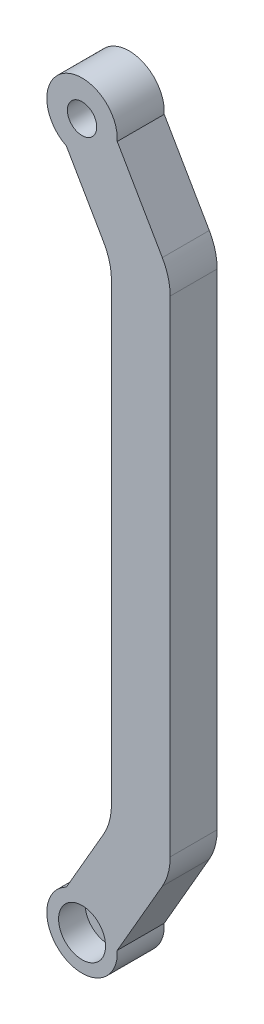
ISO-10303-21;
HEADER;
FILE_DESCRIPTION(('STEP AP214'),'2;1');
FILE_NAME('part.step','',(''),(''),'','','');
FILE_SCHEMA(('AUTOMOTIVE_DESIGN { 1 0 10303 214 1 1 1 1 }'));
ENDSEC;
DATA;
#1=APPLICATION_CONTEXT('core data for automotive mechanical design processes');
#2=APPLICATION_PROTOCOL_DEFINITION('international standard','automotive_design',2000,#1);
#3=PRODUCT_CONTEXT('',#1,'mechanical');
#4=PRODUCT('Part','Part','',(#3));
#5=PRODUCT_RELATED_PRODUCT_CATEGORY('part','',(#4));
#6=PRODUCT_DEFINITION_FORMATION('','',#4);
#7=PRODUCT_DEFINITION_CONTEXT('part definition',#1,'design');
#8=PRODUCT_DEFINITION('design','',#6,#7);
#9=PRODUCT_DEFINITION_SHAPE('','',#8);
#10=(LENGTH_UNIT() NAMED_UNIT(*) SI_UNIT(.MILLI.,.METRE.));
#11=(NAMED_UNIT(*) PLANE_ANGLE_UNIT() SI_UNIT($,.RADIAN.));
#12=(NAMED_UNIT(*) SI_UNIT($,.STERADIAN.) SOLID_ANGLE_UNIT());
#13=UNCERTAINTY_MEASURE_WITH_UNIT(LENGTH_MEASURE(1.E-05),#10,'distance_accuracy_value','');
#14=(GEOMETRIC_REPRESENTATION_CONTEXT(3) GLOBAL_UNCERTAINTY_ASSIGNED_CONTEXT((#13)) GLOBAL_UNIT_ASSIGNED_CONTEXT((#10,
#11,#12)) REPRESENTATION_CONTEXT('',''));
#15=CARTESIAN_POINT('',(0.,0.,0.));
#16=DIRECTION('',(0.,0.,1.));
#17=DIRECTION('',(1.,0.,0.));
#18=AXIS2_PLACEMENT_3D('',#15,#16,#17);
#19=CARTESIAN_POINT('',(0.,0.,0.));
#20=DIRECTION('',(0.,0.,1.));
#21=DIRECTION('',(1.,0.,0.));
#22=AXIS2_PLACEMENT_3D('',#19,#20,#21);
#23=CYLINDRICAL_SURFACE('',#22,2.);
#24=CARTESIAN_POINT('',(0.,0.,0.));
#25=DIRECTION('',(0.,0.,1.));
#26=DIRECTION('',(1.,0.,0.));
#27=AXIS2_PLACEMENT_3D('',#24,#25,#26);
#28=CIRCLE('',#27,2.);
#29=CARTESIAN_POINT('',(2.,0.,0.));
#30=VERTEX_POINT('',#29);
#31=EDGE_CURVE('E203',#30,#30,#28,.T.);
#32=ORIENTED_EDGE('',*,*,#31,.F.);
#33=EDGE_LOOP('',(#32));
#34=FACE_BOUND('',#33,.T.);
#35=CARTESIAN_POINT('',(0.,0.,3.5));
#36=DIRECTION('',(0.,0.,1.));
#37=DIRECTION('',(1.,0.,0.));
#38=AXIS2_PLACEMENT_3D('',#35,#36,#37);
#39=CIRCLE('',#38,2.);
#40=CARTESIAN_POINT('',(2.,0.,3.5));
#41=VERTEX_POINT('',#40);
#42=EDGE_CURVE('E200',#41,#41,#39,.F.);
#43=ORIENTED_EDGE('',*,*,#42,.F.);
#44=EDGE_LOOP('',(#43));
#45=FACE_BOUND('',#44,.T.);
#46=ADVANCED_FACE('F41',(#34,#45),#23,.F.);
#47=CARTESIAN_POINT('',(4.33012701892219,122.5,134.485785013841));
#48=DIRECTION('',(0.866025403784438,0.500000000000001,0.));
#49=DIRECTION('',(-0.500000000000001,0.866025403784438,0.));
#50=AXIS2_PLACEMENT_3D('',#47,#48,#49);
#51=PLANE('',#50);
#52=DIRECTION('',(0.500000000000001,-0.866025403784438,0.));
#53=VECTOR('',#52,1.);
#54=CARTESIAN_POINT('',(4.33012701892219,122.5,8.00000000000001));
#55=LINE('',#54,#53);
#56=CARTESIAN_POINT('',(5.9884394140999,119.627718676731,8.00000000000001));
#57=VERTEX_POINT('',#56);
#58=CARTESIAN_POINT('',(13.6602540378444,106.339745962156,8.00000000000001));
#59=VERTEX_POINT('',#58);
#60=EDGE_CURVE('E141',#57,#59,#55,.T.);
#61=ORIENTED_EDGE('',*,*,#60,.T.);
#62=DIRECTION('',(0.,0.,-1.));
#63=VECTOR('',#62,1.);
#64=CARTESIAN_POINT('',(13.6602540378444,106.339745962156,134.485785013841));
#65=LINE('',#64,#63);
#66=CARTESIAN_POINT('',(13.6602540378444,106.339745962156,0.));
#67=VERTEX_POINT('',#66);
#68=EDGE_CURVE('E214',#59,#67,#65,.T.);
#69=ORIENTED_EDGE('',*,*,#68,.T.);
#70=DIRECTION('',(0.500000000000001,-0.866025403784438,0.));
#71=VECTOR('',#70,1.);
#72=CARTESIAN_POINT('',(4.33012701892219,122.5,0.));
#73=LINE('',#72,#71);
#74=CARTESIAN_POINT('',(5.9884394140999,119.627718676731,0.));
#75=VERTEX_POINT('',#74);
#76=EDGE_CURVE('E168',#75,#67,#73,.T.);
#77=ORIENTED_EDGE('',*,*,#76,.F.);
#78=DIRECTION('',(0.,0.,-1.));
#79=VECTOR('',#78,1.);
#80=CARTESIAN_POINT('',(5.9884394140999,119.627718676731,8.));
#81=LINE('',#80,#79);
#82=EDGE_CURVE('E156',#75,#57,#81,.F.);
#83=ORIENTED_EDGE('',*,*,#82,.T.);
#84=EDGE_LOOP('',(#61,#69,#77,#83));
#85=FACE_BOUND('',#84,.T.);
#86=ADVANCED_FACE('F257',(#85),#51,.T.);
#87=CARTESIAN_POINT('',(-4.33012701892219,117.5,134.485785013841));
#88=DIRECTION('',(0.866025403784438,0.500000000000001,0.));
#89=DIRECTION('',(-0.500000000000001,0.866025403784438,0.));
#90=AXIS2_PLACEMENT_3D('',#87,#88,#89);
#91=PLANE('',#90);
#92=DIRECTION('',(0.500000000000001,-0.866025403784438,0.));
#93=VECTOR('',#92,1.);
#94=CARTESIAN_POINT('',(-4.33012701892219,117.5,0.));
#95=LINE('',#94,#93);
#96=CARTESIAN_POINT('',(-2.67181462374449,114.627718676731,0.));
#97=VERTEX_POINT('',#96);
#98=CARTESIAN_POINT('',(3.6602540378444,103.660254037844,0.));
#99=VERTEX_POINT('',#98);
#100=EDGE_CURVE('E131',#97,#99,#95,.T.);
#101=ORIENTED_EDGE('',*,*,#100,.T.);
#102=DIRECTION('',(0.,0.,-1.));
#103=VECTOR('',#102,1.);
#104=CARTESIAN_POINT('',(3.6602540378444,103.660254037844,8.00000000000001));
#105=LINE('',#104,#103);
#106=CARTESIAN_POINT('',(3.6602540378444,103.660254037844,8.00000000000001));
#107=VERTEX_POINT('',#106);
#108=EDGE_CURVE('E212',#99,#107,#105,.F.);
#109=ORIENTED_EDGE('',*,*,#108,.T.);
#110=DIRECTION('',(0.500000000000001,-0.866025403784438,0.));
#111=VECTOR('',#110,1.);
#112=CARTESIAN_POINT('',(-4.33012701892219,117.5,8.00000000000001));
#113=LINE('',#112,#111);
#114=CARTESIAN_POINT('',(-2.67181462374449,114.627718676731,8.00000000000001));
#115=VERTEX_POINT('',#114);
#116=EDGE_CURVE('E147',#115,#107,#113,.T.);
#117=ORIENTED_EDGE('',*,*,#116,.F.);
#118=DIRECTION('',(0.,0.,-1.));
#119=VECTOR('',#118,1.);
#120=CARTESIAN_POINT('',(-2.67181462374448,114.627718676731,8.));
#121=LINE('',#120,#119);
#122=EDGE_CURVE('E144',#97,#115,#121,.F.);
#123=ORIENTED_EDGE('',*,*,#122,.F.);
#124=EDGE_LOOP('',(#101,#109,#117,#123));
#125=FACE_BOUND('',#124,.T.);
#126=ADVANCED_FACE('F145',(#125),#91,.F.);
#127=CARTESIAN_POINT('',(0.,0.,8.));
#128=DIRECTION('',(0.,0.,-1.));
#129=DIRECTION('',(-1.,0.,0.));
#130=AXIS2_PLACEMENT_3D('',#127,#128,#129);
#131=CYLINDRICAL_SURFACE('',#130,6.);
#132=DIRECTION('',(0.,0.,-1.));
#133=VECTOR('',#132,1.);
#134=CARTESIAN_POINT('',(-2.67181462374448,5.37228132326902,8.));
#135=LINE('',#134,#133);
#136=CARTESIAN_POINT('',(-2.67181462374449,5.37228132326902,0.));
#137=VERTEX_POINT('',#136);
#138=CARTESIAN_POINT('',(-2.67181462374449,5.37228132326902,8.));
#139=VERTEX_POINT('',#138);
#140=EDGE_CURVE('E192',#137,#139,#135,.F.);
#141=ORIENTED_EDGE('',*,*,#140,.F.);
#142=CARTESIAN_POINT('',(0.,0.,0.));
#143=DIRECTION('',(0.,0.,1.));
#144=DIRECTION('',(1.,0.,0.));
#145=AXIS2_PLACEMENT_3D('',#142,#143,#144);
#146=CIRCLE('',#145,6.);
#147=CARTESIAN_POINT('',(5.98843941409989,0.372281323269007,0.));
#148=VERTEX_POINT('',#147);
#149=EDGE_CURVE('E195',#137,#148,#146,.T.);
#150=ORIENTED_EDGE('',*,*,#149,.T.);
#151=DIRECTION('',(0.,0.,-1.));
#152=VECTOR('',#151,1.);
#153=CARTESIAN_POINT('',(5.9884394140999,0.37228132326901,8.));
#154=LINE('',#153,#152);
#155=CARTESIAN_POINT('',(5.98843941409989,0.372281323269002,8.00000000000001));
#156=VERTEX_POINT('',#155);
#157=EDGE_CURVE('E180',#148,#156,#154,.F.);
#158=ORIENTED_EDGE('',*,*,#157,.T.);
#159=CARTESIAN_POINT('',(0.,0.,8.));
#160=DIRECTION('',(0.,0.,1.));
#161=DIRECTION('',(1.,0.,0.));
#162=AXIS2_PLACEMENT_3D('',#159,#160,#161);
#163=CIRCLE('',#162,6.);
#164=EDGE_CURVE('E152',#139,#156,#163,.T.);
#165=ORIENTED_EDGE('',*,*,#164,.F.);
#166=EDGE_LOOP('',(#141,#150,#158,#165));
#167=FACE_BOUND('',#166,.T.);
#168=ADVANCED_FACE('F269',(#167),#131,.T.);
#169=CARTESIAN_POINT('',(0.,0.,8.));
#170=DIRECTION('',(0.,0.,1.));
#171=DIRECTION('',(1.,0.,0.));
#172=AXIS2_PLACEMENT_3D('',#169,#170,#171);
#173=PLANE('',#172);
#174=CARTESIAN_POINT('',(0.,0.,8.));
#175=DIRECTION('',(0.,0.,1.));
#176=DIRECTION('',(1.,0.,0.));
#177=AXIS2_PLACEMENT_3D('',#174,#175,#176);
#178=CIRCLE('',#177,4.);
#179=CARTESIAN_POINT('',(4.,0.,8.));
#180=VERTEX_POINT('',#179);
#181=EDGE_CURVE('E320',#180,#180,#178,.T.);
#182=ORIENTED_EDGE('',*,*,#181,.F.);
#183=EDGE_LOOP('',(#182));
#184=FACE_BOUND('',#183,.T.);
#185=CARTESIAN_POINT('',(0.,120.,8.));
#186=DIRECTION('',(0.,0.,1.));
#187=DIRECTION('',(1.,0.,0.));
#188=AXIS2_PLACEMENT_3D('',#185,#186,#187);
#189=CIRCLE('',#188,2.5);
#190=CARTESIAN_POINT('',(2.5,120.,8.));
#191=VERTEX_POINT('',#190);
#192=EDGE_CURVE('E164',#191,#191,#189,.T.);
#193=ORIENTED_EDGE('',*,*,#192,.F.);
#194=EDGE_LOOP('',(#193));
#195=FACE_BOUND('',#194,.T.);
#196=DIRECTION('',(0.,-1.,0.));
#197=VECTOR('',#196,1.);
#198=CARTESIAN_POINT('',(15.,102.679491924311,8.00000000000001));
#199=LINE('',#198,#197);
#200=CARTESIAN_POINT('',(15.,101.339745962156,8.00000000000001));
#201=VERTEX_POINT('',#200);
#202=CARTESIAN_POINT('',(15.,18.6602540378444,8.00000000000001));
#203=VERTEX_POINT('',#202);
#204=EDGE_CURVE('E184',#201,#203,#199,.T.);
#205=ORIENTED_EDGE('',*,*,#204,.F.);
#206=CARTESIAN_POINT('',(5.00000000000001,101.339745962156,8.00000000000001));
#207=DIRECTION('',(0.,0.,1.));
#208=DIRECTION('',(1.,0.,0.));
#209=AXIS2_PLACEMENT_3D('',#206,#207,#208);
#210=CIRCLE('',#209,10.);
#211=EDGE_CURVE('E227',#201,#59,#210,.T.);
#212=ORIENTED_EDGE('',*,*,#211,.T.);
#213=ORIENTED_EDGE('',*,*,#60,.F.);
#214=CARTESIAN_POINT('',(0.,120.,8.));
#215=DIRECTION('',(0.,0.,1.));
#216=DIRECTION('',(1.,0.,0.));
#217=AXIS2_PLACEMENT_3D('',#214,#215,#216);
#218=CIRCLE('',#217,6.);
#219=EDGE_CURVE('E157',#57,#115,#218,.T.);
#220=ORIENTED_EDGE('',*,*,#219,.T.);
#221=ORIENTED_EDGE('',*,*,#116,.T.);
#222=CARTESIAN_POINT('',(-4.99999999999999,98.6602540378444,8.00000000000001));
#223=DIRECTION('',(0.,0.,1.));
#224=DIRECTION('',(1.,0.,0.));
#225=AXIS2_PLACEMENT_3D('',#222,#223,#224);
#226=CIRCLE('',#225,10.);
#227=CARTESIAN_POINT('',(5.00000000000001,98.6602540378444,8.00000000000001));
#228=VERTEX_POINT('',#227);
#229=EDGE_CURVE('E11',#107,#228,#226,.F.);
#230=ORIENTED_EDGE('',*,*,#229,.T.);
#231=DIRECTION('',(0.,-1.,0.));
#232=VECTOR('',#231,1.);
#233=CARTESIAN_POINT('',(5.00000000000001,102.679491924311,8.00000000000001));
#234=LINE('',#233,#232);
#235=CARTESIAN_POINT('',(5.00000000000001,21.3397459621556,8.00000000000001));
#236=VERTEX_POINT('',#235);
#237=EDGE_CURVE('E176',#228,#236,#234,.T.);
#238=ORIENTED_EDGE('',*,*,#237,.T.);
#239=CARTESIAN_POINT('',(-4.99999999999999,21.3397459621556,8.00000000000001));
#240=DIRECTION('',(0.,0.,1.));
#241=DIRECTION('',(1.,0.,0.));
#242=AXIS2_PLACEMENT_3D('',#239,#240,#241);
#243=CIRCLE('',#242,10.);
#244=CARTESIAN_POINT('',(3.66025403784439,16.3397459621556,8.00000000000001));
#245=VERTEX_POINT('',#244);
#246=EDGE_CURVE('E232',#236,#245,#243,.F.);
#247=ORIENTED_EDGE('',*,*,#246,.T.);
#248=DIRECTION('',(-0.500000000000001,-0.866025403784438,0.));
#249=VECTOR('',#248,1.);
#250=CARTESIAN_POINT('',(5.66987298107782,19.8205080756888,8.00000000000001));
#251=LINE('',#250,#249);
#252=EDGE_CURVE('E181',#245,#139,#251,.T.);
#253=ORIENTED_EDGE('',*,*,#252,.T.);
#254=ORIENTED_EDGE('',*,*,#164,.T.);
#255=DIRECTION('',(-0.500000000000001,-0.866025403784438,0.));
#256=VECTOR('',#255,1.);
#257=CARTESIAN_POINT('',(14.3301270189222,14.8205080756887,8.00000000000001));
#258=LINE('',#257,#256);
#259=CARTESIAN_POINT('',(13.6602540378444,13.6602540378443,8.00000000000001));
#260=VERTEX_POINT('',#259);
#261=EDGE_CURVE('E178',#260,#156,#258,.T.);
#262=ORIENTED_EDGE('',*,*,#261,.F.);
#263=CARTESIAN_POINT('',(5.00000000000001,18.6602540378444,8.00000000000001));
#264=DIRECTION('',(0.,0.,1.));
#265=DIRECTION('',(1.,0.,0.));
#266=AXIS2_PLACEMENT_3D('',#263,#264,#265);
#267=CIRCLE('',#266,10.);
#268=EDGE_CURVE('E63',#260,#203,#267,.T.);
#269=ORIENTED_EDGE('',*,*,#268,.T.);
#270=EDGE_LOOP('',(#205,#212,#213,#220,#221,#230,#238,#247,#253,#254,#262,#269));
#271=FACE_BOUND('',#270,.T.);
#272=ADVANCED_FACE('F235',(#184,#195,#271),#173,.T.);
#273=CARTESIAN_POINT('',(0.,0.,0.));
#274=DIRECTION('',(0.,0.,1.));
#275=DIRECTION('',(1.,0.,0.));
#276=AXIS2_PLACEMENT_3D('',#273,#274,#275);
#277=PLANE('',#276);
#278=ORIENTED_EDGE('',*,*,#31,.T.);
#279=EDGE_LOOP('',(#278));
#280=FACE_BOUND('',#279,.T.);
#281=CARTESIAN_POINT('',(0.,120.,0.));
#282=DIRECTION('',(0.,0.,1.));
#283=DIRECTION('',(1.,0.,0.));
#284=AXIS2_PLACEMENT_3D('',#281,#282,#283);
#285=CIRCLE('',#284,2.5);
#286=CARTESIAN_POINT('',(2.5,120.,0.));
#287=VERTEX_POINT('',#286);
#288=EDGE_CURVE('E161',#287,#287,#285,.T.);
#289=ORIENTED_EDGE('',*,*,#288,.T.);
#290=EDGE_LOOP('',(#289));
#291=FACE_BOUND('',#290,.T.);
#292=ORIENTED_EDGE('',*,*,#76,.T.);
#293=CARTESIAN_POINT('',(5.00000000000001,101.339745962156,0.));
#294=DIRECTION('',(0.,0.,1.));
#295=DIRECTION('',(1.,0.,0.));
#296=AXIS2_PLACEMENT_3D('',#293,#294,#295);
#297=CIRCLE('',#296,10.);
#298=CARTESIAN_POINT('',(15.,101.339745962156,0.));
#299=VERTEX_POINT('',#298);
#300=EDGE_CURVE('E219',#67,#299,#297,.F.);
#301=ORIENTED_EDGE('',*,*,#300,.T.);
#302=DIRECTION('',(0.,1.,0.));
#303=VECTOR('',#302,1.);
#304=CARTESIAN_POINT('',(15.,102.679491924311,0.));
#305=LINE('',#304,#303);
#306=CARTESIAN_POINT('',(15.,18.6602540378444,0.));
#307=VERTEX_POINT('',#306);
#308=EDGE_CURVE('E171',#299,#307,#305,.F.);
#309=ORIENTED_EDGE('',*,*,#308,.T.);
#310=CARTESIAN_POINT('',(5.00000000000001,18.6602540378444,0.));
#311=DIRECTION('',(0.,0.,1.));
#312=DIRECTION('',(1.,0.,0.));
#313=AXIS2_PLACEMENT_3D('',#310,#311,#312);
#314=CIRCLE('',#313,10.);
#315=CARTESIAN_POINT('',(13.6602540378444,13.6602540378443,0.));
#316=VERTEX_POINT('',#315);
#317=EDGE_CURVE('E217',#307,#316,#314,.F.);
#318=ORIENTED_EDGE('',*,*,#317,.T.);
#319=DIRECTION('',(-0.500000000000001,-0.866025403784438,0.));
#320=VECTOR('',#319,1.);
#321=CARTESIAN_POINT('',(14.3301270189222,14.8205080756887,0.));
#322=LINE('',#321,#320);
#323=EDGE_CURVE('E174',#316,#148,#322,.T.);
#324=ORIENTED_EDGE('',*,*,#323,.T.);
#325=ORIENTED_EDGE('',*,*,#149,.F.);
#326=DIRECTION('',(-0.500000000000001,-0.866025403784438,0.));
#327=VECTOR('',#326,1.);
#328=CARTESIAN_POINT('',(5.66987298107782,19.8205080756888,0.));
#329=LINE('',#328,#327);
#330=CARTESIAN_POINT('',(3.66025403784439,16.3397459621556,0.));
#331=VERTEX_POINT('',#330);
#332=EDGE_CURVE('E159',#331,#137,#329,.T.);
#333=ORIENTED_EDGE('',*,*,#332,.F.);
#334=CARTESIAN_POINT('',(-4.99999999999999,21.3397459621556,0.));
#335=DIRECTION('',(0.,0.,1.));
#336=DIRECTION('',(1.,0.,0.));
#337=AXIS2_PLACEMENT_3D('',#334,#335,#336);
#338=CIRCLE('',#337,10.);
#339=CARTESIAN_POINT('',(5.00000000000001,21.3397459621556,0.));
#340=VERTEX_POINT('',#339);
#341=EDGE_CURVE('E230',#331,#340,#338,.T.);
#342=ORIENTED_EDGE('',*,*,#341,.T.);
#343=DIRECTION('',(0.,1.,0.));
#344=VECTOR('',#343,1.);
#345=CARTESIAN_POINT('',(5.00000000000001,102.679491924311,0.));
#346=LINE('',#345,#344);
#347=CARTESIAN_POINT('',(5.00000000000001,98.6602540378444,0.));
#348=VERTEX_POINT('',#347);
#349=EDGE_CURVE('E140',#348,#340,#346,.F.);
#350=ORIENTED_EDGE('',*,*,#349,.F.);
#351=CARTESIAN_POINT('',(-4.99999999999999,98.6602540378444,0.));
#352=DIRECTION('',(0.,0.,1.));
#353=DIRECTION('',(1.,0.,0.));
#354=AXIS2_PLACEMENT_3D('',#351,#352,#353);
#355=CIRCLE('',#354,10.);
#356=EDGE_CURVE('E49',#348,#99,#355,.T.);
#357=ORIENTED_EDGE('',*,*,#356,.T.);
#358=ORIENTED_EDGE('',*,*,#100,.F.);
#359=CARTESIAN_POINT('',(0.,120.,0.));
#360=DIRECTION('',(0.,0.,1.));
#361=DIRECTION('',(1.,0.,0.));
#362=AXIS2_PLACEMENT_3D('',#359,#360,#361);
#363=CIRCLE('',#362,6.);
#364=EDGE_CURVE('E136',#75,#97,#363,.T.);
#365=ORIENTED_EDGE('',*,*,#364,.F.);
#366=EDGE_LOOP('',(#292,#301,#309,#318,#324,#325,#333,#342,#350,#357,#358,#365));
#367=FACE_BOUND('',#366,.T.);
#368=ADVANCED_FACE('F134',(#280,#291,#367),#277,.F.);
#369=CARTESIAN_POINT('',(5.66987298107782,19.8205080756888,134.485785013841));
#370=DIRECTION('',(0.866025403784438,-0.500000000000001,0.));
#371=DIRECTION('',(0.500000000000001,0.866025403784438,0.));
#372=AXIS2_PLACEMENT_3D('',#369,#370,#371);
#373=PLANE('',#372);
#374=ORIENTED_EDGE('',*,*,#252,.F.);
#375=DIRECTION('',(0.,0.,-1.));
#376=VECTOR('',#375,1.);
#377=CARTESIAN_POINT('',(3.66025403784439,16.3397459621556,0.));
#378=LINE('',#377,#376);
#379=EDGE_CURVE('E151',#245,#331,#378,.T.);
#380=ORIENTED_EDGE('',*,*,#379,.T.);
#381=ORIENTED_EDGE('',*,*,#332,.T.);
#382=ORIENTED_EDGE('',*,*,#140,.T.);
#383=EDGE_LOOP('',(#374,#380,#381,#382));
#384=FACE_BOUND('',#383,.T.);
#385=ADVANCED_FACE('F241',(#384),#373,.F.);
#386=CARTESIAN_POINT('',(14.3301270189222,14.8205080756887,134.485785013841));
#387=DIRECTION('',(0.866025403784438,-0.500000000000001,0.));
#388=DIRECTION('',(0.500000000000001,0.866025403784438,0.));
#389=AXIS2_PLACEMENT_3D('',#386,#387,#388);
#390=PLANE('',#389);
#391=ORIENTED_EDGE('',*,*,#323,.F.);
#392=DIRECTION('',(0.,0.,-1.));
#393=VECTOR('',#392,1.);
#394=CARTESIAN_POINT('',(13.6602540378444,13.6602540378443,134.485785013841));
#395=LINE('',#394,#393);
#396=EDGE_CURVE('E56',#316,#260,#395,.F.);
#397=ORIENTED_EDGE('',*,*,#396,.T.);
#398=ORIENTED_EDGE('',*,*,#261,.T.);
#399=ORIENTED_EDGE('',*,*,#157,.F.);
#400=EDGE_LOOP('',(#391,#397,#398,#399));
#401=FACE_BOUND('',#400,.T.);
#402=ADVANCED_FACE('F267',(#401),#390,.T.);
#403=CARTESIAN_POINT('',(15.,102.679491924311,134.485785013841));
#404=DIRECTION('',(1.,0.,0.));
#405=DIRECTION('',(0.,0.,-1.));
#406=AXIS2_PLACEMENT_3D('',#403,#404,#405);
#407=PLANE('',#406);
#408=ORIENTED_EDGE('',*,*,#308,.F.);
#409=DIRECTION('',(0.,0.,-1.));
#410=VECTOR('',#409,1.);
#411=CARTESIAN_POINT('',(15.,101.339745962156,134.485785013841));
#412=LINE('',#411,#410);
#413=EDGE_CURVE('E224',#299,#201,#412,.F.);
#414=ORIENTED_EDGE('',*,*,#413,.T.);
#415=ORIENTED_EDGE('',*,*,#204,.T.);
#416=DIRECTION('',(0.,0.,-1.));
#417=VECTOR('',#416,1.);
#418=CARTESIAN_POINT('',(15.,18.6602540378444,134.485785013841));
#419=LINE('',#418,#417);
#420=EDGE_CURVE('E221',#203,#307,#419,.T.);
#421=ORIENTED_EDGE('',*,*,#420,.T.);
#422=EDGE_LOOP('',(#408,#414,#415,#421));
#423=FACE_BOUND('',#422,.T.);
#424=ADVANCED_FACE('F263',(#423),#407,.T.);
#425=CARTESIAN_POINT('',(5.00000000000001,102.679491924311,134.485785013841));
#426=DIRECTION('',(1.,0.,0.));
#427=DIRECTION('',(0.,0.,-1.));
#428=AXIS2_PLACEMENT_3D('',#425,#426,#427);
#429=PLANE('',#428);
#430=ORIENTED_EDGE('',*,*,#349,.T.);
#431=DIRECTION('',(0.,0.,-1.));
#432=VECTOR('',#431,1.);
#433=CARTESIAN_POINT('',(5.00000000000001,21.3397459621556,8.00000000000001));
#434=LINE('',#433,#432);
#435=EDGE_CURVE('E210',#340,#236,#434,.F.);
#436=ORIENTED_EDGE('',*,*,#435,.T.);
#437=ORIENTED_EDGE('',*,*,#237,.F.);
#438=DIRECTION('',(0.,0.,-1.));
#439=VECTOR('',#438,1.);
#440=CARTESIAN_POINT('',(5.00000000000001,98.6602540378444,0.));
#441=LINE('',#440,#439);
#442=EDGE_CURVE('E207',#228,#348,#441,.T.);
#443=ORIENTED_EDGE('',*,*,#442,.T.);
#444=EDGE_LOOP('',(#430,#436,#437,#443));
#445=FACE_BOUND('',#444,.T.);
#446=ADVANCED_FACE('F248',(#445),#429,.F.);
#447=CARTESIAN_POINT('',(0.,120.,8.));
#448=DIRECTION('',(0.,0.,-1.));
#449=DIRECTION('',(-1.,0.,0.));
#450=AXIS2_PLACEMENT_3D('',#447,#448,#449);
#451=CYLINDRICAL_SURFACE('',#450,6.);
#452=ORIENTED_EDGE('',*,*,#82,.F.);
#453=ORIENTED_EDGE('',*,*,#364,.T.);
#454=ORIENTED_EDGE('',*,*,#122,.T.);
#455=ORIENTED_EDGE('',*,*,#219,.F.);
#456=EDGE_LOOP('',(#452,#453,#454,#455));
#457=FACE_BOUND('',#456,.T.);
#458=ADVANCED_FACE('F155',(#457),#451,.T.);
#459=CARTESIAN_POINT('',(0.,120.,0.));
#460=DIRECTION('',(0.,0.,1.));
#461=DIRECTION('',(1.,0.,0.));
#462=AXIS2_PLACEMENT_3D('',#459,#460,#461);
#463=CYLINDRICAL_SURFACE('',#462,2.5);
#464=ORIENTED_EDGE('',*,*,#288,.F.);
#465=EDGE_LOOP('',(#464));
#466=FACE_BOUND('',#465,.T.);
#467=ORIENTED_EDGE('',*,*,#192,.T.);
#468=EDGE_LOOP('',(#467));
#469=FACE_BOUND('',#468,.T.);
#470=ADVANCED_FACE('F297',(#466,#469),#463,.F.);
#471=CARTESIAN_POINT('',(0.,0.,3.5));
#472=DIRECTION('',(0.,0.,1.));
#473=DIRECTION('',(1.,0.,0.));
#474=AXIS2_PLACEMENT_3D('',#471,#472,#473);
#475=PLANE('',#474);
#476=CARTESIAN_POINT('',(0.,0.,3.5));
#477=DIRECTION('',(0.,0.,1.));
#478=DIRECTION('',(1.,0.,0.));
#479=AXIS2_PLACEMENT_3D('',#476,#477,#478);
#480=CIRCLE('',#479,4.);
#481=CARTESIAN_POINT('',(4.,0.,3.5));
#482=VERTEX_POINT('',#481);
#483=EDGE_CURVE('E204',#482,#482,#480,.T.);
#484=ORIENTED_EDGE('',*,*,#483,.T.);
#485=EDGE_LOOP('',(#484));
#486=FACE_BOUND('',#485,.T.);
#487=ORIENTED_EDGE('',*,*,#42,.T.);
#488=EDGE_LOOP('',(#487));
#489=FACE_BOUND('',#488,.T.);
#490=ADVANCED_FACE('F299',(#486,#489),#475,.T.);
#491=CARTESIAN_POINT('',(0.,0.,3.5));
#492=DIRECTION('',(0.,0.,1.));
#493=DIRECTION('',(1.,0.,0.));
#494=AXIS2_PLACEMENT_3D('',#491,#492,#493);
#495=CYLINDRICAL_SURFACE('',#494,4.);
#496=ORIENTED_EDGE('',*,*,#483,.F.);
#497=EDGE_LOOP('',(#496));
#498=FACE_BOUND('',#497,.T.);
#499=ORIENTED_EDGE('',*,*,#181,.T.);
#500=EDGE_LOOP('',(#499));
#501=FACE_BOUND('',#500,.T.);
#502=ADVANCED_FACE('F295',(#498,#501),#495,.F.);
#503=CARTESIAN_POINT('',(-4.99999999999999,21.3397459621556,134.485785013841));
#504=DIRECTION('',(0.,0.,1.));
#505=DIRECTION('',(1.,0.,0.));
#506=AXIS2_PLACEMENT_3D('',#503,#504,#505);
#507=CYLINDRICAL_SURFACE('',#506,10.);
#508=ORIENTED_EDGE('',*,*,#246,.F.);
#509=ORIENTED_EDGE('',*,*,#435,.F.);
#510=ORIENTED_EDGE('',*,*,#341,.F.);
#511=ORIENTED_EDGE('',*,*,#379,.F.);
#512=EDGE_LOOP('',(#508,#509,#510,#511));
#513=FACE_BOUND('',#512,.T.);
#514=ADVANCED_FACE('F245',(#513),#507,.F.);
#515=CARTESIAN_POINT('',(-4.99999999999999,98.6602540378444,134.485785013841));
#516=DIRECTION('',(0.,0.,1.));
#517=DIRECTION('',(1.,0.,0.));
#518=AXIS2_PLACEMENT_3D('',#515,#516,#517);
#519=CYLINDRICAL_SURFACE('',#518,10.);
#520=ORIENTED_EDGE('',*,*,#229,.F.);
#521=ORIENTED_EDGE('',*,*,#108,.F.);
#522=ORIENTED_EDGE('',*,*,#356,.F.);
#523=ORIENTED_EDGE('',*,*,#442,.F.);
#524=EDGE_LOOP('',(#520,#521,#522,#523));
#525=FACE_BOUND('',#524,.T.);
#526=ADVANCED_FACE('F252',(#525),#519,.F.);
#527=CARTESIAN_POINT('',(5.00000000000001,101.339745962156,134.485785013841));
#528=DIRECTION('',(0.,0.,-1.));
#529=DIRECTION('',(-1.,0.,0.));
#530=AXIS2_PLACEMENT_3D('',#527,#528,#529);
#531=CYLINDRICAL_SURFACE('',#530,10.);
#532=ORIENTED_EDGE('',*,*,#211,.F.);
#533=ORIENTED_EDGE('',*,*,#413,.F.);
#534=ORIENTED_EDGE('',*,*,#300,.F.);
#535=ORIENTED_EDGE('',*,*,#68,.F.);
#536=EDGE_LOOP('',(#532,#533,#534,#535));
#537=FACE_BOUND('',#536,.T.);
#538=ADVANCED_FACE('F259',(#537),#531,.T.);
#539=CARTESIAN_POINT('',(5.00000000000001,18.6602540378444,134.485785013841));
#540=DIRECTION('',(0.,0.,-1.));
#541=DIRECTION('',(-1.,0.,0.));
#542=AXIS2_PLACEMENT_3D('',#539,#540,#541);
#543=CYLINDRICAL_SURFACE('',#542,10.);
#544=ORIENTED_EDGE('',*,*,#268,.F.);
#545=ORIENTED_EDGE('',*,*,#396,.F.);
#546=ORIENTED_EDGE('',*,*,#317,.F.);
#547=ORIENTED_EDGE('',*,*,#420,.F.);
#548=EDGE_LOOP('',(#544,#545,#546,#547));
#549=FACE_BOUND('',#548,.T.);
#550=ADVANCED_FACE('F43',(#549),#543,.T.);
#551=CLOSED_SHELL('',(#46,#86,#126,#168,#272,#368,#385,#402,#424,#446,#458,#470,#490,#502,#514,
#526,#538,#550));
#552=MANIFOLD_SOLID_BREP('B2',#551);
#553=ADVANCED_BREP_SHAPE_REPRESENTATION('',(#18,#552),#14);
#554=SHAPE_DEFINITION_REPRESENTATION(#9,#553);
ENDSEC;
END-ISO-10303-21;
